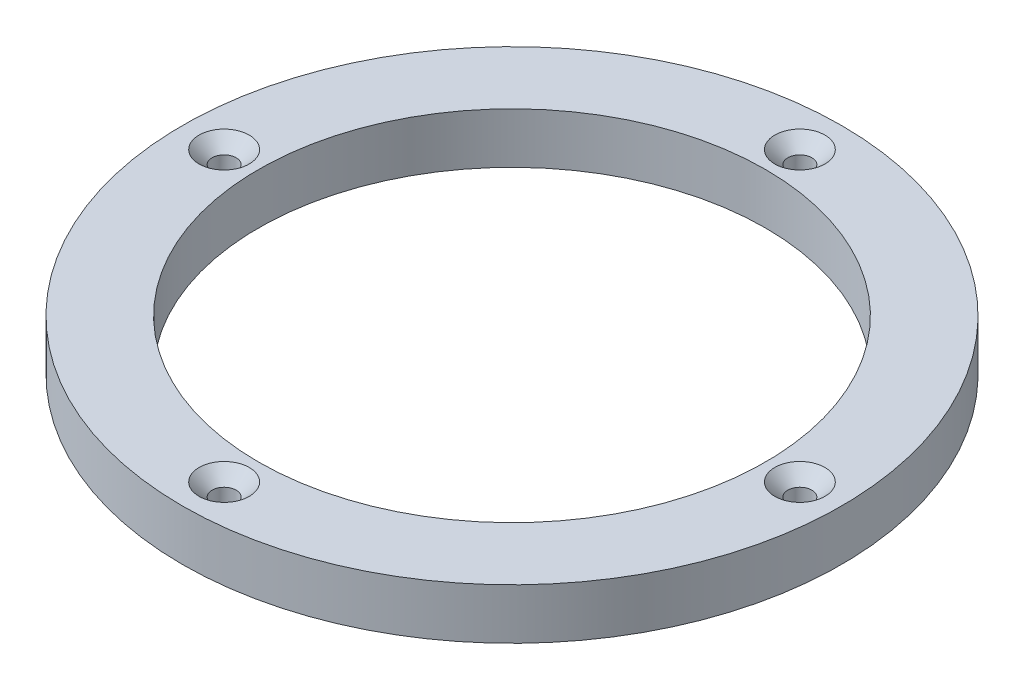
ISO-10303-21;
HEADER;
FILE_DESCRIPTION(('STEP AP214'),'2;1');
FILE_NAME('part.step','',(''),(''),'','','');
FILE_SCHEMA(('AUTOMOTIVE_DESIGN { 1 0 10303 214 1 1 1 1 }'));
ENDSEC;
DATA;
#1=APPLICATION_CONTEXT('core data for automotive mechanical design processes');
#2=APPLICATION_PROTOCOL_DEFINITION('international standard','automotive_design',2000,#1);
#3=PRODUCT_CONTEXT('',#1,'mechanical');
#4=PRODUCT('Part','Part','',(#3));
#5=PRODUCT_RELATED_PRODUCT_CATEGORY('part','',(#4));
#6=PRODUCT_DEFINITION_FORMATION('','',#4);
#7=PRODUCT_DEFINITION_CONTEXT('part definition',#1,'design');
#8=PRODUCT_DEFINITION('design','',#6,#7);
#9=PRODUCT_DEFINITION_SHAPE('','',#8);
#10=(LENGTH_UNIT() NAMED_UNIT(*) SI_UNIT(.MILLI.,.METRE.));
#11=(NAMED_UNIT(*) PLANE_ANGLE_UNIT() SI_UNIT($,.RADIAN.));
#12=(NAMED_UNIT(*) SI_UNIT($,.STERADIAN.) SOLID_ANGLE_UNIT());
#13=UNCERTAINTY_MEASURE_WITH_UNIT(LENGTH_MEASURE(1.E-05),#10,'distance_accuracy_value','');
#14=(GEOMETRIC_REPRESENTATION_CONTEXT(3) GLOBAL_UNCERTAINTY_ASSIGNED_CONTEXT((#13)) GLOBAL_UNIT_ASSIGNED_CONTEXT((#10,
#11,#12)) REPRESENTATION_CONTEXT('',''));
#15=CARTESIAN_POINT('',(0.,0.,0.));
#16=DIRECTION('',(0.,0.,1.));
#17=DIRECTION('',(1.,0.,0.));
#18=AXIS2_PLACEMENT_3D('',#15,#16,#17);
#19=CARTESIAN_POINT('',(0.,9.5,0.));
#20=DIRECTION('',(0.,1.,0.));
#21=DIRECTION('',(0.,0.,1.));
#22=AXIS2_PLACEMENT_3D('',#19,#20,#21);
#23=PLANE('',#22);
#24=CARTESIAN_POINT('',(0.,9.5,53.95));
#25=DIRECTION('',(0.,1.,0.));
#26=DIRECTION('',(0.,0.,1.));
#27=AXIS2_PLACEMENT_3D('',#24,#25,#26);
#28=CIRCLE('',#27,4.7);
#29=CARTESIAN_POINT('',(0.,9.5,58.65));
#30=VERTEX_POINT('',#29);
#31=EDGE_CURVE('E94',#30,#30,#28,.T.);
#32=ORIENTED_EDGE('',*,*,#31,.F.);
#33=EDGE_LOOP('',(#32));
#34=FACE_BOUND('',#33,.T.);
#35=CARTESIAN_POINT('',(-53.95,9.5,0.));
#36=DIRECTION('',(0.,1.,0.));
#37=DIRECTION('',(0.,0.,1.));
#38=AXIS2_PLACEMENT_3D('',#35,#36,#37);
#39=CIRCLE('',#38,4.7);
#40=CARTESIAN_POINT('',(-53.95,9.5,4.70000000000001));
#41=VERTEX_POINT('',#40);
#42=EDGE_CURVE('E88',#41,#41,#39,.T.);
#43=ORIENTED_EDGE('',*,*,#42,.F.);
#44=EDGE_LOOP('',(#43));
#45=FACE_BOUND('',#44,.T.);
#46=CARTESIAN_POINT('',(0.,9.5,-53.95));
#47=DIRECTION('',(0.,1.,0.));
#48=DIRECTION('',(0.,0.,1.));
#49=AXIS2_PLACEMENT_3D('',#46,#47,#48);
#50=CIRCLE('',#49,4.7);
#51=CARTESIAN_POINT('',(0.,9.5,-49.25));
#52=VERTEX_POINT('',#51);
#53=EDGE_CURVE('E82',#52,#52,#50,.T.);
#54=ORIENTED_EDGE('',*,*,#53,.F.);
#55=EDGE_LOOP('',(#54));
#56=FACE_BOUND('',#55,.T.);
#57=CARTESIAN_POINT('',(53.95,9.5,0.));
#58=DIRECTION('',(0.,1.,0.));
#59=DIRECTION('',(0.,0.,1.));
#60=AXIS2_PLACEMENT_3D('',#57,#58,#59);
#61=CIRCLE('',#60,4.7);
#62=CARTESIAN_POINT('',(53.95,9.5,4.7));
#63=VERTEX_POINT('',#62);
#64=EDGE_CURVE('E76',#63,#63,#61,.T.);
#65=ORIENTED_EDGE('',*,*,#64,.F.);
#66=EDGE_LOOP('',(#65));
#67=FACE_BOUND('',#66,.T.);
#68=CARTESIAN_POINT('',(0.,9.5,0.));
#69=DIRECTION('',(0.,1.,0.));
#70=DIRECTION('',(0.,0.,1.));
#71=AXIS2_PLACEMENT_3D('',#68,#69,#70);
#72=CIRCLE('',#71,61.7650829549725);
#73=CARTESIAN_POINT('',(0.,9.5,61.7650829549725));
#74=VERTEX_POINT('',#73);
#75=EDGE_CURVE('E10',#74,#74,#72,.T.);
#76=ORIENTED_EDGE('',*,*,#75,.T.);
#77=EDGE_LOOP('',(#76));
#78=FACE_BOUND('',#77,.T.);
#79=CARTESIAN_POINT('',(0.,9.5,0.));
#80=DIRECTION('',(0.,1.,0.));
#81=DIRECTION('',(0.,0.,1.));
#82=AXIS2_PLACEMENT_3D('',#79,#80,#81);
#83=CIRCLE('',#82,47.5);
#84=CARTESIAN_POINT('',(0.,9.5,47.5));
#85=VERTEX_POINT('',#84);
#86=EDGE_CURVE('E54',#85,#85,#83,.T.);
#87=ORIENTED_EDGE('',*,*,#86,.F.);
#88=EDGE_LOOP('',(#87));
#89=FACE_BOUND('',#88,.T.);
#90=ADVANCED_FACE('F43',(#34,#45,#56,#67,#78,#89),#23,.T.);
#91=CARTESIAN_POINT('',(0.,0.,0.));
#92=DIRECTION('',(0.,1.,0.));
#93=DIRECTION('',(0.,0.,1.));
#94=AXIS2_PLACEMENT_3D('',#91,#92,#93);
#95=PLANE('',#94);
#96=CARTESIAN_POINT('',(0.,0.,-53.95));
#97=DIRECTION('',(0.,1.,0.));
#98=DIRECTION('',(0.,0.,1.));
#99=AXIS2_PLACEMENT_3D('',#96,#97,#98);
#100=CIRCLE('',#99,2.25);
#101=CARTESIAN_POINT('',(0.,0.,-51.7));
#102=VERTEX_POINT('',#101);
#103=EDGE_CURVE('E59',#102,#102,#100,.T.);
#104=ORIENTED_EDGE('',*,*,#103,.T.);
#105=EDGE_LOOP('',(#104));
#106=FACE_BOUND('',#105,.T.);
#107=CARTESIAN_POINT('',(0.,0.,53.95));
#108=DIRECTION('',(0.,1.,0.));
#109=DIRECTION('',(0.,0.,-1.));
#110=AXIS2_PLACEMENT_3D('',#107,#108,#109);
#111=CIRCLE('',#110,2.25);
#112=CARTESIAN_POINT('',(0.,0.,51.7));
#113=VERTEX_POINT('',#112);
#114=EDGE_CURVE('E69',#113,#113,#111,.T.);
#115=ORIENTED_EDGE('',*,*,#114,.T.);
#116=EDGE_LOOP('',(#115));
#117=FACE_BOUND('',#116,.T.);
#118=CARTESIAN_POINT('',(53.95,0.,0.));
#119=DIRECTION('',(0.,1.,0.));
#120=DIRECTION('',(0.,0.,1.));
#121=AXIS2_PLACEMENT_3D('',#118,#119,#120);
#122=CIRCLE('',#121,2.25);
#123=CARTESIAN_POINT('',(53.95,0.,2.25));
#124=VERTEX_POINT('',#123);
#125=EDGE_CURVE('E65',#124,#124,#122,.T.);
#126=ORIENTED_EDGE('',*,*,#125,.T.);
#127=EDGE_LOOP('',(#126));
#128=FACE_BOUND('',#127,.T.);
#129=CARTESIAN_POINT('',(-53.95,0.,0.));
#130=DIRECTION('',(0.,1.,0.));
#131=DIRECTION('',(0.,0.,-1.));
#132=AXIS2_PLACEMENT_3D('',#129,#130,#131);
#133=CIRCLE('',#132,2.25);
#134=CARTESIAN_POINT('',(-53.95,0.,-2.24999999999999));
#135=VERTEX_POINT('',#134);
#136=EDGE_CURVE('E62',#135,#135,#133,.T.);
#137=ORIENTED_EDGE('',*,*,#136,.T.);
#138=EDGE_LOOP('',(#137));
#139=FACE_BOUND('',#138,.T.);
#140=CARTESIAN_POINT('',(0.,0.,0.));
#141=DIRECTION('',(0.,1.,0.));
#142=DIRECTION('',(0.,0.,1.));
#143=AXIS2_PLACEMENT_3D('',#140,#141,#142);
#144=CIRCLE('',#143,61.7650829549725);
#145=CARTESIAN_POINT('',(0.,0.,61.7650829549725));
#146=VERTEX_POINT('',#145);
#147=EDGE_CURVE('E47',#146,#146,#144,.T.);
#148=ORIENTED_EDGE('',*,*,#147,.F.);
#149=EDGE_LOOP('',(#148));
#150=FACE_BOUND('',#149,.T.);
#151=CARTESIAN_POINT('',(0.,0.,0.));
#152=DIRECTION('',(0.,1.,0.));
#153=DIRECTION('',(0.,0.,1.));
#154=AXIS2_PLACEMENT_3D('',#151,#152,#153);
#155=CIRCLE('',#154,47.5);
#156=CARTESIAN_POINT('',(0.,0.,47.5));
#157=VERTEX_POINT('',#156);
#158=EDGE_CURVE('E56',#157,#157,#155,.T.);
#159=ORIENTED_EDGE('',*,*,#158,.T.);
#160=EDGE_LOOP('',(#159));
#161=FACE_BOUND('',#160,.T.);
#162=ADVANCED_FACE('F102',(#106,#117,#128,#139,#150,#161),#95,.F.);
#163=CARTESIAN_POINT('',(0.,9.5,0.));
#164=DIRECTION('',(0.,-1.,0.));
#165=DIRECTION('',(0.,0.,-1.));
#166=AXIS2_PLACEMENT_3D('',#163,#164,#165);
#167=CYLINDRICAL_SURFACE('',#166,61.7650829549725);
#168=ORIENTED_EDGE('',*,*,#75,.F.);
#169=EDGE_LOOP('',(#168));
#170=FACE_BOUND('',#169,.T.);
#171=ORIENTED_EDGE('',*,*,#147,.T.);
#172=EDGE_LOOP('',(#171));
#173=FACE_BOUND('',#172,.T.);
#174=ADVANCED_FACE('F45',(#170,#173),#167,.T.);
#175=CARTESIAN_POINT('',(0.,9.5,0.));
#176=DIRECTION('',(0.,-1.,0.));
#177=DIRECTION('',(0.,0.,-1.));
#178=AXIS2_PLACEMENT_3D('',#175,#176,#177);
#179=CYLINDRICAL_SURFACE('',#178,47.5);
#180=ORIENTED_EDGE('',*,*,#86,.T.);
#181=EDGE_LOOP('',(#180));
#182=FACE_BOUND('',#181,.T.);
#183=ORIENTED_EDGE('',*,*,#158,.F.);
#184=EDGE_LOOP('',(#183));
#185=FACE_BOUND('',#184,.T.);
#186=ADVANCED_FACE('F112',(#182,#185),#179,.F.);
#187=CARTESIAN_POINT('',(-53.95,0.,0.));
#188=DIRECTION('',(0.,1.,0.));
#189=DIRECTION('',(0.,0.,1.));
#190=AXIS2_PLACEMENT_3D('',#187,#188,#189);
#191=CYLINDRICAL_SURFACE('',#190,2.25);
#192=CARTESIAN_POINT('',(-53.95,7.05,0.));
#193=DIRECTION('',(0.,1.,0.));
#194=DIRECTION('',(0.,0.,1.));
#195=AXIS2_PLACEMENT_3D('',#192,#193,#194);
#196=CIRCLE('',#195,2.25);
#197=CARTESIAN_POINT('',(-53.95,7.05,2.25000000000001));
#198=VERTEX_POINT('',#197);
#199=EDGE_CURVE('E85',#198,#198,#196,.T.);
#200=ORIENTED_EDGE('',*,*,#199,.T.);
#201=EDGE_LOOP('',(#200));
#202=FACE_BOUND('',#201,.T.);
#203=ORIENTED_EDGE('',*,*,#136,.F.);
#204=EDGE_LOOP('',(#203));
#205=FACE_BOUND('',#204,.T.);
#206=ADVANCED_FACE('F115',(#202,#205),#191,.F.);
#207=CARTESIAN_POINT('',(53.95,0.,0.));
#208=DIRECTION('',(0.,1.,0.));
#209=DIRECTION('',(0.,0.,1.));
#210=AXIS2_PLACEMENT_3D('',#207,#208,#209);
#211=CYLINDRICAL_SURFACE('',#210,2.25);
#212=CARTESIAN_POINT('',(53.95,7.05,0.));
#213=DIRECTION('',(0.,1.,0.));
#214=DIRECTION('',(0.,0.,1.));
#215=AXIS2_PLACEMENT_3D('',#212,#213,#214);
#216=CIRCLE('',#215,2.25);
#217=CARTESIAN_POINT('',(53.95,7.05,2.25));
#218=VERTEX_POINT('',#217);
#219=EDGE_CURVE('E66',#218,#218,#216,.T.);
#220=ORIENTED_EDGE('',*,*,#219,.T.);
#221=EDGE_LOOP('',(#220));
#222=FACE_BOUND('',#221,.T.);
#223=ORIENTED_EDGE('',*,*,#125,.F.);
#224=EDGE_LOOP('',(#223));
#225=FACE_BOUND('',#224,.T.);
#226=ADVANCED_FACE('F129',(#222,#225),#211,.F.);
#227=CARTESIAN_POINT('',(0.,0.,53.95));
#228=DIRECTION('',(0.,1.,0.));
#229=DIRECTION('',(0.,0.,1.));
#230=AXIS2_PLACEMENT_3D('',#227,#228,#229);
#231=CYLINDRICAL_SURFACE('',#230,2.25);
#232=CARTESIAN_POINT('',(0.,7.05,53.95));
#233=DIRECTION('',(0.,1.,0.));
#234=DIRECTION('',(0.,0.,1.));
#235=AXIS2_PLACEMENT_3D('',#232,#233,#234);
#236=CIRCLE('',#235,2.24999999999999);
#237=CARTESIAN_POINT('',(0.,7.05,56.2));
#238=VERTEX_POINT('',#237);
#239=EDGE_CURVE('E91',#238,#238,#236,.T.);
#240=ORIENTED_EDGE('',*,*,#239,.T.);
#241=EDGE_LOOP('',(#240));
#242=FACE_BOUND('',#241,.T.);
#243=ORIENTED_EDGE('',*,*,#114,.F.);
#244=EDGE_LOOP('',(#243));
#245=FACE_BOUND('',#244,.T.);
#246=ADVANCED_FACE('F133',(#242,#245),#231,.F.);
#247=CARTESIAN_POINT('',(0.,0.,-53.95));
#248=DIRECTION('',(0.,1.,0.));
#249=DIRECTION('',(0.,0.,1.));
#250=AXIS2_PLACEMENT_3D('',#247,#248,#249);
#251=CYLINDRICAL_SURFACE('',#250,2.25);
#252=CARTESIAN_POINT('',(0.,7.05,-53.95));
#253=DIRECTION('',(0.,1.,0.));
#254=DIRECTION('',(0.,0.,1.));
#255=AXIS2_PLACEMENT_3D('',#252,#253,#254);
#256=CIRCLE('',#255,2.24999999999999);
#257=CARTESIAN_POINT('',(0.,7.05,-51.7));
#258=VERTEX_POINT('',#257);
#259=EDGE_CURVE('E79',#258,#258,#256,.T.);
#260=ORIENTED_EDGE('',*,*,#259,.T.);
#261=EDGE_LOOP('',(#260));
#262=FACE_BOUND('',#261,.T.);
#263=ORIENTED_EDGE('',*,*,#103,.F.);
#264=EDGE_LOOP('',(#263));
#265=FACE_BOUND('',#264,.T.);
#266=ADVANCED_FACE('F137',(#262,#265),#251,.F.);
#267=CARTESIAN_POINT('',(53.95,9.5,0.));
#268=DIRECTION('',(0.,1.,0.));
#269=DIRECTION('',(0.,0.,1.));
#270=AXIS2_PLACEMENT_3D('',#267,#268,#269);
#271=CONICAL_SURFACE('',#270,4.7,0.785398163397448);
#272=ORIENTED_EDGE('',*,*,#219,.F.);
#273=EDGE_LOOP('',(#272));
#274=FACE_BOUND('',#273,.T.);
#275=ORIENTED_EDGE('',*,*,#64,.T.);
#276=EDGE_LOOP('',(#275));
#277=FACE_BOUND('',#276,.T.);
#278=ADVANCED_FACE('F141',(#274,#277),#271,.F.);
#279=CARTESIAN_POINT('',(0.,9.5,-53.95));
#280=DIRECTION('',(0.,1.,0.));
#281=DIRECTION('',(0.,0.,1.));
#282=AXIS2_PLACEMENT_3D('',#279,#280,#281);
#283=CONICAL_SURFACE('',#282,4.7,0.785398163397449);
#284=ORIENTED_EDGE('',*,*,#259,.F.);
#285=EDGE_LOOP('',(#284));
#286=FACE_BOUND('',#285,.T.);
#287=ORIENTED_EDGE('',*,*,#53,.T.);
#288=EDGE_LOOP('',(#287));
#289=FACE_BOUND('',#288,.T.);
#290=ADVANCED_FACE('F145',(#286,#289),#283,.F.);
#291=CARTESIAN_POINT('',(-53.95,9.5,0.));
#292=DIRECTION('',(0.,1.,0.));
#293=DIRECTION('',(0.,0.,1.));
#294=AXIS2_PLACEMENT_3D('',#291,#292,#293);
#295=CONICAL_SURFACE('',#294,4.7,0.785398163397448);
#296=ORIENTED_EDGE('',*,*,#199,.F.);
#297=EDGE_LOOP('',(#296));
#298=FACE_BOUND('',#297,.T.);
#299=ORIENTED_EDGE('',*,*,#42,.T.);
#300=EDGE_LOOP('',(#299));
#301=FACE_BOUND('',#300,.T.);
#302=ADVANCED_FACE('F149',(#298,#301),#295,.F.);
#303=CARTESIAN_POINT('',(0.,9.5,53.95));
#304=DIRECTION('',(0.,1.,0.));
#305=DIRECTION('',(0.,0.,1.));
#306=AXIS2_PLACEMENT_3D('',#303,#304,#305);
#307=CONICAL_SURFACE('',#306,4.7,0.785398163397449);
#308=ORIENTED_EDGE('',*,*,#239,.F.);
#309=EDGE_LOOP('',(#308));
#310=FACE_BOUND('',#309,.T.);
#311=ORIENTED_EDGE('',*,*,#31,.T.);
#312=EDGE_LOOP('',(#311));
#313=FACE_BOUND('',#312,.T.);
#314=ADVANCED_FACE('F98',(#310,#313),#307,.F.);
#315=CLOSED_SHELL('',(#90,#162,#174,#186,#206,#226,#246,#266,#278,#290,#302,#314));
#316=MANIFOLD_SOLID_BREP('B2',#315);
#317=ADVANCED_BREP_SHAPE_REPRESENTATION('',(#18,#316),#14);
#318=SHAPE_DEFINITION_REPRESENTATION(#9,#317);
ENDSEC;
END-ISO-10303-21;
